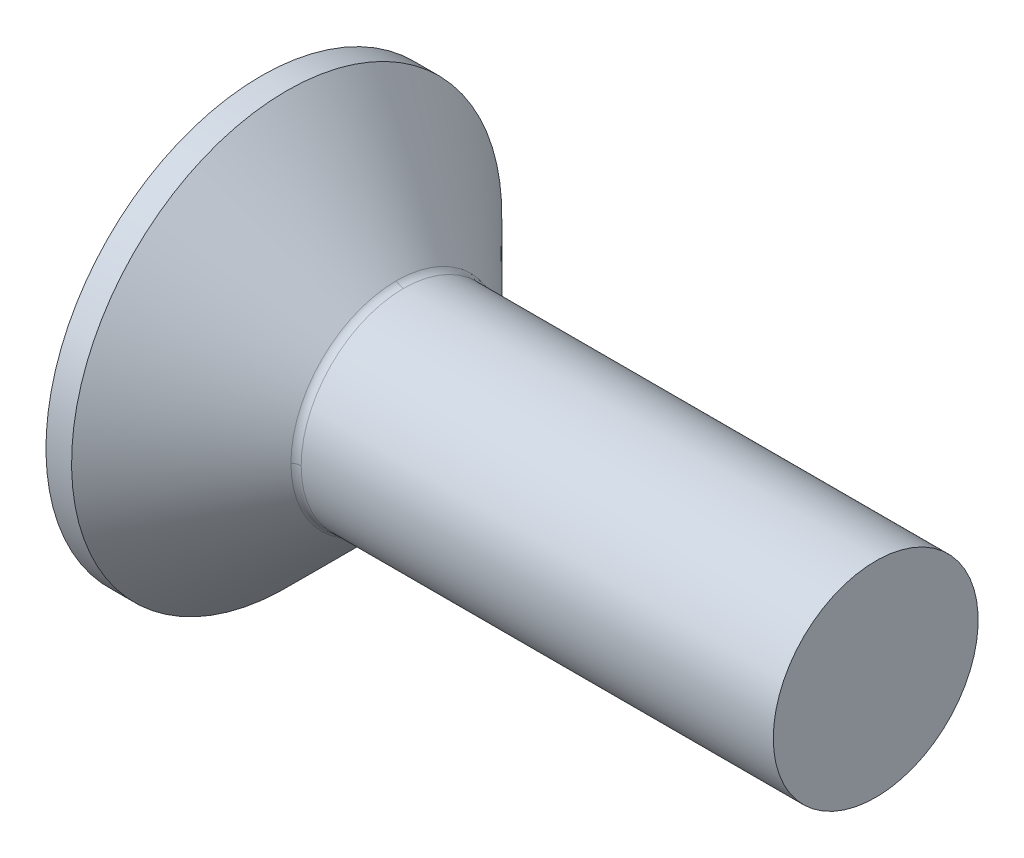
ISO-10303-21;
HEADER;
FILE_DESCRIPTION(('STEP AP214'),'2;1');
FILE_NAME('part.step','',(''),(''),'','','');
FILE_SCHEMA(('AUTOMOTIVE_DESIGN { 1 0 10303 214 1 1 1 1 }'));
ENDSEC;
DATA;
#1=APPLICATION_CONTEXT('core data for automotive mechanical design processes');
#2=APPLICATION_PROTOCOL_DEFINITION('international standard','automotive_design',2000,#1);
#3=PRODUCT_CONTEXT('',#1,'mechanical');
#4=PRODUCT('Part','Part','',(#3));
#5=PRODUCT_RELATED_PRODUCT_CATEGORY('part','',(#4));
#6=PRODUCT_DEFINITION_FORMATION('','',#4);
#7=PRODUCT_DEFINITION_CONTEXT('part definition',#1,'design');
#8=PRODUCT_DEFINITION('design','',#6,#7);
#9=PRODUCT_DEFINITION_SHAPE('','',#8);
#10=(LENGTH_UNIT() NAMED_UNIT(*) SI_UNIT(.MILLI.,.METRE.));
#11=(NAMED_UNIT(*) PLANE_ANGLE_UNIT() SI_UNIT($,.RADIAN.));
#12=(NAMED_UNIT(*) SI_UNIT($,.STERADIAN.) SOLID_ANGLE_UNIT());
#13=UNCERTAINTY_MEASURE_WITH_UNIT(LENGTH_MEASURE(1.E-05),#10,'distance_accuracy_value','');
#14=(GEOMETRIC_REPRESENTATION_CONTEXT(3) GLOBAL_UNCERTAINTY_ASSIGNED_CONTEXT((#13)) GLOBAL_UNIT_ASSIGNED_CONTEXT((#10,
#11,#12)) REPRESENTATION_CONTEXT('',''));
#15=CARTESIAN_POINT('',(0.,0.,0.));
#16=DIRECTION('',(0.,0.,1.));
#17=DIRECTION('',(1.,0.,0.));
#18=AXIS2_PLACEMENT_3D('',#15,#16,#17);
#19=CARTESIAN_POINT('',(12.,0.,0.));
#20=DIRECTION('',(1.,0.,0.));
#21=DIRECTION('',(0.,1.,0.));
#22=AXIS2_PLACEMENT_3D('',#19,#20,#21);
#23=PLANE('',#22);
#24=CARTESIAN_POINT('',(12.,0.,0.));
#25=DIRECTION('',(1.,0.,0.));
#26=DIRECTION('',(0.,0.,1.));
#27=AXIS2_PLACEMENT_3D('',#24,#25,#26);
#28=CIRCLE('',#27,2.);
#29=CARTESIAN_POINT('',(12.,0.,2.));
#30=VERTEX_POINT('',#29);
#31=EDGE_CURVE('E11',#30,#30,#28,.T.);
#32=ORIENTED_EDGE('',*,*,#31,.T.);
#33=EDGE_LOOP('',(#32));
#34=FACE_BOUND('',#33,.T.);
#35=ADVANCED_FACE('F16',(#34),#23,.T.);
#36=CARTESIAN_POINT('',(0.,0.,0.));
#37=DIRECTION('',(1.,0.,0.));
#38=DIRECTION('',(0.,0.,1.));
#39=AXIS2_PLACEMENT_3D('',#36,#37,#38);
#40=CYLINDRICAL_SURFACE('',#39,2.);
#41=CARTESIAN_POINT('',(2.78284271247462,0.,0.));
#42=DIRECTION('',(-1.,0.,0.));
#43=DIRECTION('',(0.,1.,0.));
#44=AXIS2_PLACEMENT_3D('',#41,#42,#43);
#45=CIRCLE('',#44,2.);
#46=CARTESIAN_POINT('',(2.78284271247462,0.,2.));
#47=VERTEX_POINT('',#46);
#48=CARTESIAN_POINT('',(2.78284271247462,2.,0.));
#49=VERTEX_POINT('',#48);
#50=EDGE_CURVE('E27',#47,#49,#45,.T.);
#51=ORIENTED_EDGE('',*,*,#50,.F.);
#52=CARTESIAN_POINT('',(2.78284271247462,0.,0.));
#53=DIRECTION('',(-1.,0.,0.));
#54=DIRECTION('',(0.,0.,1.));
#55=AXIS2_PLACEMENT_3D('',#52,#53,#54);
#56=CIRCLE('',#55,2.);
#57=EDGE_CURVE('E442',#49,#47,#56,.T.);
#58=ORIENTED_EDGE('',*,*,#57,.F.);
#59=EDGE_LOOP('',(#51,#58));
#60=FACE_BOUND('',#59,.T.);
#61=ORIENTED_EDGE('',*,*,#31,.F.);
#62=EDGE_LOOP('',(#61));
#63=FACE_BOUND('',#62,.T.);
#64=ADVANCED_FACE('F18',(#60,#63),#40,.T.);
#65=CARTESIAN_POINT('',(2.78284271247462,0.,0.));
#66=DIRECTION('',(1.,0.,0.));
#67=DIRECTION('',(0.,0.980066577841242,-0.198669330795061));
#68=AXIS2_PLACEMENT_3D('',#65,#66,#67);
#69=TOROIDAL_SURFACE('',#68,2.2,0.2);
#70=ORIENTED_EDGE('',*,*,#50,.T.);
#71=CARTESIAN_POINT('',(2.78284271247462,2.2,0.));
#72=DIRECTION('',(0.,0.,-1.));
#73=DIRECTION('',(0.,-1.,0.));
#74=AXIS2_PLACEMENT_3D('',#71,#72,#73);
#75=CIRCLE('',#74,0.2);
#76=CARTESIAN_POINT('',(2.64142135623731,2.05857864376269,0.));
#77=VERTEX_POINT('',#76);
#78=EDGE_CURVE('E377',#49,#77,#75,.T.);
#79=ORIENTED_EDGE('',*,*,#78,.T.);
#80=CARTESIAN_POINT('',(2.64142135623731,0.,0.));
#81=DIRECTION('',(-1.,0.,0.));
#82=DIRECTION('',(0.,1.,0.));
#83=AXIS2_PLACEMENT_3D('',#80,#81,#82);
#84=CIRCLE('',#83,2.05857864376269);
#85=CARTESIAN_POINT('',(2.64142135623731,0.,2.05857864376269));
#86=VERTEX_POINT('',#85);
#87=EDGE_CURVE('E396',#86,#77,#84,.T.);
#88=ORIENTED_EDGE('',*,*,#87,.F.);
#89=CARTESIAN_POINT('',(2.78284271247462,0.,2.2));
#90=DIRECTION('',(0.,1.,0.));
#91=DIRECTION('',(0.,0.,-1.));
#92=AXIS2_PLACEMENT_3D('',#89,#90,#91);
#93=CIRCLE('',#92,0.2);
#94=EDGE_CURVE('E380',#47,#86,#93,.T.);
#95=ORIENTED_EDGE('',*,*,#94,.F.);
#96=EDGE_LOOP('',(#70,#79,#88,#95));
#97=FACE_BOUND('',#96,.T.);
#98=ADVANCED_FACE('F743',(#97),#69,.F.);
#99=CARTESIAN_POINT('',(2.78284271247462,0.,0.));
#100=DIRECTION('',(1.,0.,0.));
#101=DIRECTION('',(0.,0.198669330795061,0.980066577841242));
#102=AXIS2_PLACEMENT_3D('',#99,#100,#101);
#103=TOROIDAL_SURFACE('',#102,2.2,0.2);
#104=ORIENTED_EDGE('',*,*,#57,.T.);
#105=ORIENTED_EDGE('',*,*,#94,.T.);
#106=CARTESIAN_POINT('',(2.64142135623731,0.,0.));
#107=DIRECTION('',(-1.,0.,0.));
#108=DIRECTION('',(0.,0.,1.));
#109=AXIS2_PLACEMENT_3D('',#106,#107,#108);
#110=CIRCLE('',#109,2.05857864376269);
#111=EDGE_CURVE('E347',#77,#86,#110,.T.);
#112=ORIENTED_EDGE('',*,*,#111,.F.);
#113=ORIENTED_EDGE('',*,*,#78,.F.);
#114=EDGE_LOOP('',(#104,#105,#112,#113));
#115=FACE_BOUND('',#114,.T.);
#116=ADVANCED_FACE('F747',(#115),#103,.F.);
#117=CARTESIAN_POINT('',(1.57071067811866,0.,0.));
#118=DIRECTION('',(-1.,0.,0.));
#119=DIRECTION('',(0.,-1.,0.));
#120=AXIS2_PLACEMENT_3D('',#117,#118,#119);
#121=CONICAL_SURFACE('',#120,3.12928932188134,0.785398163397448);
#122=ORIENTED_EDGE('',*,*,#111,.T.);
#123=ORIENTED_EDGE('',*,*,#87,.T.);
#124=EDGE_LOOP('',(#122,#123));
#125=FACE_BOUND('',#124,.T.);
#126=CARTESIAN_POINT('',(0.5,0.,0.));
#127=DIRECTION('',(1.,0.,0.));
#128=DIRECTION('',(0.,1.,0.));
#129=AXIS2_PLACEMENT_3D('',#126,#127,#128);
#130=CIRCLE('',#129,4.2);
#131=CARTESIAN_POINT('',(0.5,4.2,0.));
#132=VERTEX_POINT('',#131);
#133=EDGE_CURVE('E345',#132,#132,#130,.T.);
#134=ORIENTED_EDGE('',*,*,#133,.T.);
#135=EDGE_LOOP('',(#134));
#136=FACE_BOUND('',#135,.T.);
#137=ADVANCED_FACE('F789',(#125,#136),#121,.T.);
#138=CARTESIAN_POINT('',(2.6,0.,0.));
#139=DIRECTION('',(1.,0.,0.));
#140=DIRECTION('',(0.,1.,0.));
#141=AXIS2_PLACEMENT_3D('',#138,#139,#140);
#142=PLANE('',#141);
#143=DIRECTION('',(0.,0.,1.));
#144=VECTOR('',#143,1.);
#145=CARTESIAN_POINT('',(2.6,0.172517251725172,0.443540079669605));
#146=LINE('',#145,#144);
#147=CARTESIAN_POINT('',(2.6,0.172517251725172,0.443540079669605));
#148=VERTEX_POINT('',#147);
#149=CARTESIAN_POINT('',(2.6,0.172517251725172,0.668156442865066));
#150=VERTEX_POINT('',#149);
#151=EDGE_CURVE('E389',#148,#150,#146,.T.);
#152=ORIENTED_EDGE('',*,*,#151,.F.);
#153=DIRECTION('',(0.,-0.272628878987048,0.962119272409749));
#154=VECTOR('',#153,1.);
#155=CARTESIAN_POINT('',(2.6,0.232358321079116,0.232358321079116));
#156=LINE('',#155,#154);
#157=CARTESIAN_POINT('',(2.6,0.232358321079116,0.232358321079116));
#158=VERTEX_POINT('',#157);
#159=EDGE_CURVE('E259',#158,#148,#156,.T.);
#160=ORIENTED_EDGE('',*,*,#159,.F.);
#161=DIRECTION('',(0.,-0.96211927240975,0.272628878987045));
#162=VECTOR('',#161,1.);
#163=CARTESIAN_POINT('',(2.6,0.443540079669605,0.172517251725173));
#164=LINE('',#163,#162);
#165=CARTESIAN_POINT('',(2.6,0.443540079669605,0.172517251725173));
#166=VERTEX_POINT('',#165);
#167=EDGE_CURVE('E107',#166,#158,#164,.T.);
#168=ORIENTED_EDGE('',*,*,#167,.F.);
#169=DIRECTION('',(0.,-1.,0.));
#170=VECTOR('',#169,1.);
#171=CARTESIAN_POINT('',(2.6,0.668156442865066,0.172517251725173));
#172=LINE('',#171,#170);
#173=CARTESIAN_POINT('',(2.6,0.668156442865066,0.172517251725173));
#174=VERTEX_POINT('',#173);
#175=EDGE_CURVE('E357',#174,#166,#172,.T.);
#176=ORIENTED_EDGE('',*,*,#175,.F.);
#177=DIRECTION('',(0.,0.,1.));
#178=VECTOR('',#177,1.);
#179=CARTESIAN_POINT('',(2.6,0.668156442865066,-0.172517251725172));
#180=LINE('',#179,#178);
#181=CARTESIAN_POINT('',(2.6,0.668156442865066,-0.172517251725172));
#182=VERTEX_POINT('',#181);
#183=EDGE_CURVE('E447',#182,#174,#180,.T.);
#184=ORIENTED_EDGE('',*,*,#183,.F.);
#185=DIRECTION('',(0.,1.,0.));
#186=VECTOR('',#185,1.);
#187=CARTESIAN_POINT('',(2.6,0.443540079669605,-0.172517251725172));
#188=LINE('',#187,#186);
#189=CARTESIAN_POINT('',(2.6,0.443540079669605,-0.172517251725172));
#190=VERTEX_POINT('',#189);
#191=EDGE_CURVE('E454',#190,#182,#188,.T.);
#192=ORIENTED_EDGE('',*,*,#191,.F.);
#193=DIRECTION('',(0.,0.96211927240975,0.272628878987047));
#194=VECTOR('',#193,1.);
#195=CARTESIAN_POINT('',(2.6,0.232358321079116,-0.232358321079116));
#196=LINE('',#195,#194);
#197=CARTESIAN_POINT('',(2.6,0.232358321079116,-0.232358321079116));
#198=VERTEX_POINT('',#197);
#199=EDGE_CURVE('E437',#198,#190,#196,.T.);
#200=ORIENTED_EDGE('',*,*,#199,.F.);
#201=DIRECTION('',(0.,0.272628878987045,0.96211927240975));
#202=VECTOR('',#201,1.);
#203=CARTESIAN_POINT('',(2.6,0.172517251725173,-0.443540079669605));
#204=LINE('',#203,#202);
#205=CARTESIAN_POINT('',(2.6,0.172517251725173,-0.443540079669605));
#206=VERTEX_POINT('',#205);
#207=EDGE_CURVE('E20',#206,#198,#204,.T.);
#208=ORIENTED_EDGE('',*,*,#207,.F.);
#209=DIRECTION('',(0.,0.,1.));
#210=VECTOR('',#209,1.);
#211=CARTESIAN_POINT('',(2.6,0.172517251725173,-0.668156442865066));
#212=LINE('',#211,#210);
#213=CARTESIAN_POINT('',(2.6,0.172517251725173,-0.668156442865066));
#214=VERTEX_POINT('',#213);
#215=EDGE_CURVE('E332',#214,#206,#212,.T.);
#216=ORIENTED_EDGE('',*,*,#215,.F.);
#217=DIRECTION('',(0.,1.,0.));
#218=VECTOR('',#217,1.);
#219=CARTESIAN_POINT('',(2.6,-0.172517251725172,-0.668156442865066));
#220=LINE('',#219,#218);
#221=CARTESIAN_POINT('',(2.6,-0.172517251725172,-0.668156442865066));
#222=VERTEX_POINT('',#221);
#223=EDGE_CURVE('E302',#222,#214,#220,.T.);
#224=ORIENTED_EDGE('',*,*,#223,.F.);
#225=DIRECTION('',(0.,0.,-1.));
#226=VECTOR('',#225,1.);
#227=CARTESIAN_POINT('',(2.6,-0.172517251725172,-0.443540079669605));
#228=LINE('',#227,#226);
#229=CARTESIAN_POINT('',(2.6,-0.172517251725172,-0.443540079669605));
#230=VERTEX_POINT('',#229);
#231=EDGE_CURVE('E301',#230,#222,#228,.T.);
#232=ORIENTED_EDGE('',*,*,#231,.F.);
#233=DIRECTION('',(0.,0.272628878987046,-0.96211927240975));
#234=VECTOR('',#233,1.);
#235=CARTESIAN_POINT('',(2.6,-0.232358321079116,-0.232358321079116));
#236=LINE('',#235,#234);
#237=CARTESIAN_POINT('',(2.6,-0.232358321079116,-0.232358321079116));
#238=VERTEX_POINT('',#237);
#239=EDGE_CURVE('E356',#238,#230,#236,.T.);
#240=ORIENTED_EDGE('',*,*,#239,.F.);
#241=DIRECTION('',(0.,0.96211927240975,-0.272628878987046));
#242=VECTOR('',#241,1.);
#243=CARTESIAN_POINT('',(2.6,-0.443540079669605,-0.172517251725172));
#244=LINE('',#243,#242);
#245=CARTESIAN_POINT('',(2.6,-0.443540079669605,-0.172517251725172));
#246=VERTEX_POINT('',#245);
#247=EDGE_CURVE('E287',#246,#238,#244,.T.);
#248=ORIENTED_EDGE('',*,*,#247,.F.);
#249=DIRECTION('',(0.,1.,0.));
#250=VECTOR('',#249,1.);
#251=CARTESIAN_POINT('',(2.6,-0.668156442865066,-0.172517251725172));
#252=LINE('',#251,#250);
#253=CARTESIAN_POINT('',(2.6,-0.668156442865066,-0.172517251725172));
#254=VERTEX_POINT('',#253);
#255=EDGE_CURVE('E286',#254,#246,#252,.T.);
#256=ORIENTED_EDGE('',*,*,#255,.F.);
#257=DIRECTION('',(0.,0.,-1.));
#258=VECTOR('',#257,1.);
#259=CARTESIAN_POINT('',(2.6,-0.668156442865066,0.172517251725173));
#260=LINE('',#259,#258);
#261=CARTESIAN_POINT('',(2.6,-0.668156442865066,0.172517251725173));
#262=VERTEX_POINT('',#261);
#263=EDGE_CURVE('E267',#262,#254,#260,.T.);
#264=ORIENTED_EDGE('',*,*,#263,.F.);
#265=DIRECTION('',(0.,-1.,0.));
#266=VECTOR('',#265,1.);
#267=CARTESIAN_POINT('',(2.6,-0.443540079669605,0.172517251725173));
#268=LINE('',#267,#266);
#269=CARTESIAN_POINT('',(2.6,-0.443540079669605,0.172517251725173));
#270=VERTEX_POINT('',#269);
#271=EDGE_CURVE('E339',#270,#262,#268,.T.);
#272=ORIENTED_EDGE('',*,*,#271,.F.);
#273=DIRECTION('',(0.,-0.96211927240975,-0.272628878987045));
#274=VECTOR('',#273,1.);
#275=CARTESIAN_POINT('',(2.6,-0.232358321079116,0.232358321079116));
#276=LINE('',#275,#274);
#277=CARTESIAN_POINT('',(2.6,-0.232358321079116,0.232358321079116));
#278=VERTEX_POINT('',#277);
#279=EDGE_CURVE('E230',#278,#270,#276,.T.);
#280=ORIENTED_EDGE('',*,*,#279,.F.);
#281=DIRECTION('',(0.,-0.272628878987044,-0.962119272409751));
#282=VECTOR('',#281,1.);
#283=CARTESIAN_POINT('',(2.6,-0.172517251725173,0.443540079669605));
#284=LINE('',#283,#282);
#285=CARTESIAN_POINT('',(2.6,-0.172517251725173,0.443540079669605));
#286=VERTEX_POINT('',#285);
#287=EDGE_CURVE('E229',#286,#278,#284,.T.);
#288=ORIENTED_EDGE('',*,*,#287,.F.);
#289=DIRECTION('',(0.,0.,-1.));
#290=VECTOR('',#289,1.);
#291=CARTESIAN_POINT('',(2.6,-0.172517251725172,0.668156442865066));
#292=LINE('',#291,#290);
#293=CARTESIAN_POINT('',(2.6,-0.172517251725172,0.668156442865066));
#294=VERTEX_POINT('',#293);
#295=EDGE_CURVE('E225',#294,#286,#292,.T.);
#296=ORIENTED_EDGE('',*,*,#295,.F.);
#297=DIRECTION('',(0.,-1.,0.));
#298=VECTOR('',#297,1.);
#299=CARTESIAN_POINT('',(2.6,0.172517251725172,0.668156442865066));
#300=LINE('',#299,#298);
#301=EDGE_CURVE('E124',#150,#294,#300,.T.);
#302=ORIENTED_EDGE('',*,*,#301,.F.);
#303=EDGE_LOOP('',(#152,#160,#168,#176,#184,#192,#200,#208,#216,#224,#232,#240,#248,#256,#264,
#272,#280,#288,#296,#302));
#304=FACE_BOUND('',#303,.T.);
#305=ADVANCED_FACE('F414',(#304),#142,.F.);
#306=CARTESIAN_POINT('',(0.,0.,0.));
#307=DIRECTION('',(1.,0.,0.));
#308=DIRECTION('',(0.,1.,0.));
#309=AXIS2_PLACEMENT_3D('',#306,#307,#308);
#310=CYLINDRICAL_SURFACE('',#309,4.2);
#311=ORIENTED_EDGE('',*,*,#133,.F.);
#312=EDGE_LOOP('',(#311));
#313=FACE_BOUND('',#312,.T.);
#314=CARTESIAN_POINT('',(0.,0.,0.));
#315=DIRECTION('',(1.,0.,0.));
#316=DIRECTION('',(0.,1.,0.));
#317=AXIS2_PLACEMENT_3D('',#314,#315,#316);
#318=CIRCLE('',#317,4.2);
#319=CARTESIAN_POINT('',(0.,4.2,0.));
#320=VERTEX_POINT('',#319);
#321=EDGE_CURVE('E254',#320,#320,#318,.T.);
#322=ORIENTED_EDGE('',*,*,#321,.T.);
#323=EDGE_LOOP('',(#322));
#324=FACE_BOUND('',#323,.T.);
#325=ADVANCED_FACE('F727',(#313,#324),#310,.T.);
#326=CARTESIAN_POINT('',(0.,0.575,2.22696542406926));
#327=DIRECTION('',(0.514206841452647,0.,0.85766620791733));
#328=DIRECTION('',(0.,-1.,0.));
#329=AXIS2_PLACEMENT_3D('',#326,#327,#328);
#330=PLANE('',#329);
#331=DIRECTION('',(0.,-1.,0.));
#332=VECTOR('',#331,1.);
#333=CARTESIAN_POINT('',(0.,0.575,2.22696542406926));
#334=LINE('',#333,#332);
#335=CARTESIAN_POINT('',(0.,0.575,2.22696542406926));
#336=VERTEX_POINT('',#335);
#337=CARTESIAN_POINT('',(0.,-0.575,2.22696542406926));
#338=VERTEX_POINT('',#337);
#339=EDGE_CURVE('E247',#336,#338,#334,.T.);
#340=ORIENTED_EDGE('',*,*,#339,.F.);
#341=DIRECTION('',(0.850205551202319,-0.131612718017855,-0.509733865032247));
#342=VECTOR('',#341,1.);
#343=CARTESIAN_POINT('',(0.,0.575,2.22696542406926));
#344=LINE('',#343,#342);
#345=EDGE_CURVE('E481',#336,#150,#344,.T.);
#346=ORIENTED_EDGE('',*,*,#345,.T.);
#347=ORIENTED_EDGE('',*,*,#301,.T.);
#348=DIRECTION('',(0.850205551202319,0.131612718017856,-0.509733865032246));
#349=VECTOR('',#348,1.);
#350=CARTESIAN_POINT('',(0.,-0.575,2.22696542406926));
#351=LINE('',#350,#349);
#352=EDGE_CURVE('E294',#338,#294,#351,.T.);
#353=ORIENTED_EDGE('',*,*,#352,.F.);
#354=EDGE_LOOP('',(#340,#346,#347,#353));
#355=FACE_BOUND('',#354,.T.);
#356=ADVANCED_FACE('F759',(#355),#330,.F.);
#357=CARTESIAN_POINT('',(0.,-0.575,2.22696542406926));
#358=DIRECTION('',(0.152978962750563,-0.988229445501277,0.));
#359=DIRECTION('',(0.,0.,-1.));
#360=AXIS2_PLACEMENT_3D('',#357,#358,#359);
#361=PLANE('',#360);
#362=DIRECTION('',(0.,0.,-1.));
#363=VECTOR('',#362,1.);
#364=CARTESIAN_POINT('',(0.,-0.575,2.22696542406926));
#365=LINE('',#364,#363);
#366=CARTESIAN_POINT('',(0.,-0.575,1.47831908553879));
#367=VERTEX_POINT('',#366);
#368=EDGE_CURVE('E223',#338,#367,#365,.T.);
#369=ORIENTED_EDGE('',*,*,#368,.F.);
#370=ORIENTED_EDGE('',*,*,#352,.T.);
#371=ORIENTED_EDGE('',*,*,#295,.T.);
#372=DIRECTION('',(0.919655056316218,0.142363574819613,-0.366015286506718));
#373=VECTOR('',#372,1.);
#374=CARTESIAN_POINT('',(0.,-0.575,1.47831908553879));
#375=LINE('',#374,#373);
#376=EDGE_CURVE('E218',#367,#286,#375,.T.);
#377=ORIENTED_EDGE('',*,*,#376,.F.);
#378=EDGE_LOOP('',(#369,#370,#371,#377));
#379=FACE_BOUND('',#378,.T.);
#380=ADVANCED_FACE('F220',(#379),#361,.F.);
#381=CARTESIAN_POINT('',(0.,-0.575,1.47831908553879));
#382=DIRECTION('',(0.249312008142373,-0.931738638625509,0.264020135384217));
#383=DIRECTION('',(-0.966015607772417,-0.258483743280089,0.));
#384=AXIS2_PLACEMENT_3D('',#381,#382,#383);
#385=PLANE('',#384);
#386=DIRECTION('',(0.,-0.272628878987044,-0.962119272409751));
#387=VECTOR('',#386,1.);
#388=CARTESIAN_POINT('',(0.,-0.575,1.47831908553879));
#389=LINE('',#388,#387);
#390=CARTESIAN_POINT('',(0.,-0.774450284156694,0.774450284156694));
#391=VERTEX_POINT('',#390);
#392=EDGE_CURVE('E233',#367,#391,#389,.T.);
#393=ORIENTED_EDGE('',*,*,#392,.F.);
#394=ORIENTED_EDGE('',*,*,#376,.T.);
#395=ORIENTED_EDGE('',*,*,#287,.T.);
#396=DIRECTION('',(0.95917274636367,0.199984552694921,-0.199984552694921));
#397=VECTOR('',#396,1.);
#398=CARTESIAN_POINT('',(0.,-0.774450284156694,0.774450284156694));
#399=LINE('',#398,#397);
#400=EDGE_CURVE('E236',#391,#278,#399,.T.);
#401=ORIENTED_EDGE('',*,*,#400,.F.);
#402=EDGE_LOOP('',(#393,#394,#395,#401));
#403=FACE_BOUND('',#402,.T.);
#404=ADVANCED_FACE('F234',(#403),#385,.F.);
#405=CARTESIAN_POINT('',(0.,-0.774450284156694,0.774450284156694));
#406=DIRECTION('',(0.249312008142374,-0.264020135384219,0.931738638625508));
#407=DIRECTION('',(-0.7270686071443,-0.686564811583908,0.));
#408=AXIS2_PLACEMENT_3D('',#405,#406,#407);
#409=PLANE('',#408);
#410=DIRECTION('',(0.,-0.96211927240975,-0.272628878987046));
#411=VECTOR('',#410,1.);
#412=CARTESIAN_POINT('',(0.,-0.774450284156694,0.774450284156694));
#413=LINE('',#412,#411);
#414=CARTESIAN_POINT('',(0.,-1.47831908553879,0.575));
#415=VERTEX_POINT('',#414);
#416=EDGE_CURVE('E241',#391,#415,#413,.T.);
#417=ORIENTED_EDGE('',*,*,#416,.F.);
#418=ORIENTED_EDGE('',*,*,#400,.T.);
#419=ORIENTED_EDGE('',*,*,#279,.T.);
#420=DIRECTION('',(0.919655056316218,0.366015286506719,-0.142363574819612));
#421=VECTOR('',#420,1.);
#422=CARTESIAN_POINT('',(0.,-1.47831908553879,0.575));
#423=LINE('',#422,#421);
#424=EDGE_CURVE('E270',#415,#270,#423,.T.);
#425=ORIENTED_EDGE('',*,*,#424,.F.);
#426=EDGE_LOOP('',(#417,#418,#419,#425));
#427=FACE_BOUND('',#426,.T.);
#428=ADVANCED_FACE('F774',(#427),#409,.F.);
#429=CARTESIAN_POINT('',(0.,-1.47831908553879,0.575));
#430=DIRECTION('',(0.152978962750562,0.,0.988229445501277));
#431=DIRECTION('',(0.,-1.,0.));
#432=AXIS2_PLACEMENT_3D('',#429,#430,#431);
#433=PLANE('',#432);
#434=DIRECTION('',(0.,-1.,0.));
#435=VECTOR('',#434,1.);
#436=CARTESIAN_POINT('',(0.,-1.47831908553879,0.575));
#437=LINE('',#436,#435);
#438=CARTESIAN_POINT('',(0.,-2.22696542406926,0.575));
#439=VERTEX_POINT('',#438);
#440=EDGE_CURVE('E266',#415,#439,#437,.T.);
#441=ORIENTED_EDGE('',*,*,#440,.F.);
#442=ORIENTED_EDGE('',*,*,#424,.T.);
#443=ORIENTED_EDGE('',*,*,#271,.T.);
#444=DIRECTION('',(0.85020555120232,0.509733865032246,-0.131612718017855));
#445=VECTOR('',#444,1.);
#446=CARTESIAN_POINT('',(0.,-2.22696542406926,0.575));
#447=LINE('',#446,#445);
#448=EDGE_CURVE('E271',#439,#262,#447,.T.);
#449=ORIENTED_EDGE('',*,*,#448,.F.);
#450=EDGE_LOOP('',(#441,#442,#443,#449));
#451=FACE_BOUND('',#450,.T.);
#452=ADVANCED_FACE('F464',(#451),#433,.F.);
#453=CARTESIAN_POINT('',(0.,-2.22696542406926,0.575));
#454=DIRECTION('',(0.514206841452646,-0.85766620791733,0.));
#455=DIRECTION('',(0.,0.,-1.));
#456=AXIS2_PLACEMENT_3D('',#453,#454,#455);
#457=PLANE('',#456);
#458=DIRECTION('',(0.,0.,-1.));
#459=VECTOR('',#458,1.);
#460=CARTESIAN_POINT('',(0.,-2.22696542406926,0.575));
#461=LINE('',#460,#459);
#462=CARTESIAN_POINT('',(0.,-2.22696542406926,-0.575));
#463=VERTEX_POINT('',#462);
#464=EDGE_CURVE('E434',#439,#463,#461,.T.);
#465=ORIENTED_EDGE('',*,*,#464,.F.);
#466=ORIENTED_EDGE('',*,*,#448,.T.);
#467=ORIENTED_EDGE('',*,*,#263,.T.);
#468=DIRECTION('',(0.85020555120232,0.509733865032246,0.131612718017856));
#469=VECTOR('',#468,1.);
#470=CARTESIAN_POINT('',(0.,-2.22696542406926,-0.575));
#471=LINE('',#470,#469);
#472=EDGE_CURVE('E282',#463,#254,#471,.T.);
#473=ORIENTED_EDGE('',*,*,#472,.F.);
#474=EDGE_LOOP('',(#465,#466,#467,#473));
#475=FACE_BOUND('',#474,.T.);
#476=ADVANCED_FACE('F471',(#475),#457,.F.);
#477=CARTESIAN_POINT('',(0.,-2.22696542406926,-0.575));
#478=DIRECTION('',(0.152978962750563,0.,-0.988229445501277));
#479=DIRECTION('',(0.,-1.,0.));
#480=AXIS2_PLACEMENT_3D('',#477,#478,#479);
#481=PLANE('',#480);
#482=DIRECTION('',(0.,1.,0.));
#483=VECTOR('',#482,1.);
#484=CARTESIAN_POINT('',(0.,-2.22696542406926,-0.575));
#485=LINE('',#484,#483);
#486=CARTESIAN_POINT('',(0.,-1.47831908553879,-0.575));
#487=VERTEX_POINT('',#486);
#488=EDGE_CURVE('E293',#463,#487,#485,.T.);
#489=ORIENTED_EDGE('',*,*,#488,.F.);
#490=ORIENTED_EDGE('',*,*,#472,.T.);
#491=ORIENTED_EDGE('',*,*,#255,.T.);
#492=DIRECTION('',(0.919655056316218,0.366015286506718,0.142363574819613));
#493=VECTOR('',#492,1.);
#494=CARTESIAN_POINT('',(0.,-1.47831908553879,-0.575));
#495=LINE('',#494,#493);
#496=EDGE_CURVE('E366',#487,#246,#495,.T.);
#497=ORIENTED_EDGE('',*,*,#496,.F.);
#498=EDGE_LOOP('',(#489,#490,#491,#497));
#499=FACE_BOUND('',#498,.T.);
#500=ADVANCED_FACE('F770',(#499),#481,.F.);
#501=CARTESIAN_POINT('',(0.,-1.47831908553879,-0.575));
#502=DIRECTION('',(0.249312008142374,-0.264020135384218,-0.931738638625509));
#503=DIRECTION('',(0.,-0.96211927240975,0.272628878987045));
#504=AXIS2_PLACEMENT_3D('',#501,#502,#503);
#505=PLANE('',#504);
#506=DIRECTION('',(0.,0.96211927240975,-0.272628878987045));
#507=VECTOR('',#506,1.);
#508=CARTESIAN_POINT('',(0.,-1.47831908553879,-0.575));
#509=LINE('',#508,#507);
#510=CARTESIAN_POINT('',(0.,-0.774450284156695,-0.774450284156695));
#511=VERTEX_POINT('',#510);
#512=EDGE_CURVE('E288',#487,#511,#509,.T.);
#513=ORIENTED_EDGE('',*,*,#512,.F.);
#514=ORIENTED_EDGE('',*,*,#496,.T.);
#515=ORIENTED_EDGE('',*,*,#247,.T.);
#516=DIRECTION('',(0.95917274636367,0.199984552694921,0.199984552694921));
#517=VECTOR('',#516,1.);
#518=CARTESIAN_POINT('',(0.,-0.774450284156695,-0.774450284156695));
#519=LINE('',#518,#517);
#520=EDGE_CURVE('E352',#511,#238,#519,.T.);
#521=ORIENTED_EDGE('',*,*,#520,.F.);
#522=EDGE_LOOP('',(#513,#514,#515,#521));
#523=FACE_BOUND('',#522,.T.);
#524=ADVANCED_FACE('F764',(#523),#505,.F.);
#525=CARTESIAN_POINT('',(0.,-0.774450284156695,-0.774450284156695));
#526=DIRECTION('',(0.249312008142374,-0.931738638625509,-0.264020135384218));
#527=DIRECTION('',(0.,0.272628878987045,-0.96211927240975));
#528=AXIS2_PLACEMENT_3D('',#525,#526,#527);
#529=PLANE('',#528);
#530=DIRECTION('',(0.,0.272628878987045,-0.96211927240975));
#531=VECTOR('',#530,1.);
#532=CARTESIAN_POINT('',(0.,-0.774450284156695,-0.774450284156695));
#533=LINE('',#532,#531);
#534=CARTESIAN_POINT('',(0.,-0.575,-1.47831908553879));
#535=VERTEX_POINT('',#534);
#536=EDGE_CURVE('E292',#511,#535,#533,.T.);
#537=ORIENTED_EDGE('',*,*,#536,.F.);
#538=ORIENTED_EDGE('',*,*,#520,.T.);
#539=ORIENTED_EDGE('',*,*,#239,.T.);
#540=DIRECTION('',(0.919655056316218,0.142363574819613,0.366015286506718));
#541=VECTOR('',#540,1.);
#542=CARTESIAN_POINT('',(0.,-0.575,-1.47831908553879));
#543=LINE('',#542,#541);
#544=EDGE_CURVE('E297',#535,#230,#543,.T.);
#545=ORIENTED_EDGE('',*,*,#544,.F.);
#546=EDGE_LOOP('',(#537,#538,#539,#545));
#547=FACE_BOUND('',#546,.T.);
#548=ADVANCED_FACE('F761',(#547),#529,.F.);
#549=CARTESIAN_POINT('',(0.,-0.575,-1.47831908553879));
#550=DIRECTION('',(0.152978962750563,-0.988229445501277,0.));
#551=DIRECTION('',(0.,0.,-1.));
#552=AXIS2_PLACEMENT_3D('',#549,#550,#551);
#553=PLANE('',#552);
#554=DIRECTION('',(0.,0.,-1.));
#555=VECTOR('',#554,1.);
#556=CARTESIAN_POINT('',(0.,-0.575,-1.47831908553879));
#557=LINE('',#556,#555);
#558=CARTESIAN_POINT('',(0.,-0.575,-2.22696542406926));
#559=VERTEX_POINT('',#558);
#560=EDGE_CURVE('E308',#535,#559,#557,.T.);
#561=ORIENTED_EDGE('',*,*,#560,.F.);
#562=ORIENTED_EDGE('',*,*,#544,.T.);
#563=ORIENTED_EDGE('',*,*,#231,.T.);
#564=DIRECTION('',(0.850205551202319,0.131612718017856,0.509733865032247));
#565=VECTOR('',#564,1.);
#566=CARTESIAN_POINT('',(0.,-0.575,-2.22696542406926));
#567=LINE('',#566,#565);
#568=EDGE_CURVE('E328',#559,#222,#567,.T.);
#569=ORIENTED_EDGE('',*,*,#568,.F.);
#570=EDGE_LOOP('',(#561,#562,#563,#569));
#571=FACE_BOUND('',#570,.T.);
#572=ADVANCED_FACE('F753',(#571),#553,.F.);
#573=CARTESIAN_POINT('',(0.,-0.575,-2.22696542406926));
#574=DIRECTION('',(0.514206841452647,0.,-0.85766620791733));
#575=DIRECTION('',(0.,-1.,0.));
#576=AXIS2_PLACEMENT_3D('',#573,#574,#575);
#577=PLANE('',#576);
#578=DIRECTION('',(0.,1.,0.));
#579=VECTOR('',#578,1.);
#580=CARTESIAN_POINT('',(0.,-0.575,-2.22696542406926));
#581=LINE('',#580,#579);
#582=CARTESIAN_POINT('',(0.,0.575,-2.22696542406926));
#583=VERTEX_POINT('',#582);
#584=EDGE_CURVE('E311',#559,#583,#581,.T.);
#585=ORIENTED_EDGE('',*,*,#584,.F.);
#586=ORIENTED_EDGE('',*,*,#568,.T.);
#587=ORIENTED_EDGE('',*,*,#223,.T.);
#588=DIRECTION('',(0.850205551202319,-0.131612718017855,0.509733865032247));
#589=VECTOR('',#588,1.);
#590=CARTESIAN_POINT('',(0.,0.575,-2.22696542406926));
#591=LINE('',#590,#589);
#592=EDGE_CURVE('E410',#583,#214,#591,.T.);
#593=ORIENTED_EDGE('',*,*,#592,.F.);
#594=EDGE_LOOP('',(#585,#586,#587,#593));
#595=FACE_BOUND('',#594,.T.);
#596=ADVANCED_FACE('F408',(#595),#577,.F.);
#597=CARTESIAN_POINT('',(0.,0.575,-2.22696542406926));
#598=DIRECTION('',(0.152978962750562,0.988229445501277,0.));
#599=DIRECTION('',(0.,0.,-1.));
#600=AXIS2_PLACEMENT_3D('',#597,#598,#599);
#601=PLANE('',#600);
#602=DIRECTION('',(0.,0.,1.));
#603=VECTOR('',#602,1.);
#604=CARTESIAN_POINT('',(0.,0.575,-2.22696542406926));
#605=LINE('',#604,#603);
#606=CARTESIAN_POINT('',(0.,0.575,-1.47831908553879));
#607=VERTEX_POINT('',#606);
#608=EDGE_CURVE('E319',#583,#607,#605,.T.);
#609=ORIENTED_EDGE('',*,*,#608,.F.);
#610=ORIENTED_EDGE('',*,*,#592,.T.);
#611=ORIENTED_EDGE('',*,*,#215,.T.);
#612=DIRECTION('',(0.919655056316218,-0.142363574819612,0.366015286506718));
#613=VECTOR('',#612,1.);
#614=CARTESIAN_POINT('',(0.,0.575,-1.47831908553879));
#615=LINE('',#614,#613);
#616=EDGE_CURVE('E427',#607,#206,#615,.T.);
#617=ORIENTED_EDGE('',*,*,#616,.F.);
#618=EDGE_LOOP('',(#609,#610,#611,#617));
#619=FACE_BOUND('',#618,.T.);
#620=ADVANCED_FACE('F421',(#619),#601,.F.);
#621=CARTESIAN_POINT('',(0.,0.575,-1.47831908553879));
#622=DIRECTION('',(0.249312008142374,0.931738638625508,-0.264020135384221));
#623=DIRECTION('',(-0.727068607144303,0.,-0.686564811583906));
#624=AXIS2_PLACEMENT_3D('',#621,#622,#623);
#625=PLANE('',#624);
#626=DIRECTION('',(0.,0.272628878987048,0.962119272409749));
#627=VECTOR('',#626,1.);
#628=CARTESIAN_POINT('',(0.,0.575,-1.47831908553879));
#629=LINE('',#628,#627);
#630=CARTESIAN_POINT('',(0.,0.774450284156695,-0.774450284156695));
#631=VERTEX_POINT('',#630);
#632=EDGE_CURVE('E307',#607,#631,#629,.T.);
#633=ORIENTED_EDGE('',*,*,#632,.F.);
#634=ORIENTED_EDGE('',*,*,#616,.T.);
#635=ORIENTED_EDGE('',*,*,#207,.T.);
#636=DIRECTION('',(0.95917274636367,-0.199984552694921,0.199984552694921));
#637=VECTOR('',#636,1.);
#638=CARTESIAN_POINT('',(0.,0.774450284156695,-0.774450284156695));
#639=LINE('',#638,#637);
#640=EDGE_CURVE('E487',#631,#198,#639,.T.);
#641=ORIENTED_EDGE('',*,*,#640,.F.);
#642=EDGE_LOOP('',(#633,#634,#635,#641));
#643=FACE_BOUND('',#642,.T.);
#644=ADVANCED_FACE('F766',(#643),#625,.F.);
#645=CARTESIAN_POINT('',(0.,0.774450284156695,-0.774450284156695));
#646=DIRECTION('',(0.249312008142374,0.26402013538422,-0.931738638625508));
#647=DIRECTION('',(-0.966015607772417,0.,-0.258483743280091));
#648=AXIS2_PLACEMENT_3D('',#645,#646,#647);
#649=PLANE('',#648);
#650=DIRECTION('',(0.,0.96211927240975,0.272628878987047));
#651=VECTOR('',#650,1.);
#652=CARTESIAN_POINT('',(0.,0.774450284156695,-0.774450284156695));
#653=LINE('',#652,#651);
#654=CARTESIAN_POINT('',(0.,1.47831908553879,-0.575));
#655=VERTEX_POINT('',#654);
#656=EDGE_CURVE('E303',#631,#655,#653,.T.);
#657=ORIENTED_EDGE('',*,*,#656,.F.);
#658=ORIENTED_EDGE('',*,*,#640,.T.);
#659=ORIENTED_EDGE('',*,*,#199,.T.);
#660=DIRECTION('',(0.919655056316218,-0.366015286506718,0.142363574819613));
#661=VECTOR('',#660,1.);
#662=CARTESIAN_POINT('',(0.,1.47831908553879,-0.575));
#663=LINE('',#662,#661);
#664=EDGE_CURVE('E450',#655,#190,#663,.T.);
#665=ORIENTED_EDGE('',*,*,#664,.F.);
#666=EDGE_LOOP('',(#657,#658,#659,#665));
#667=FACE_BOUND('',#666,.T.);
#668=ADVANCED_FACE('F543',(#667),#649,.F.);
#669=CARTESIAN_POINT('',(0.,1.47831908553879,-0.575));
#670=DIRECTION('',(0.152978962750563,0.,-0.988229445501277));
#671=DIRECTION('',(0.,-1.,0.));
#672=AXIS2_PLACEMENT_3D('',#669,#670,#671);
#673=PLANE('',#672);
#674=DIRECTION('',(0.,1.,0.));
#675=VECTOR('',#674,1.);
#676=CARTESIAN_POINT('',(0.,1.47831908553879,-0.575));
#677=LINE('',#676,#675);
#678=CARTESIAN_POINT('',(0.,2.22696542406926,-0.575));
#679=VERTEX_POINT('',#678);
#680=EDGE_CURVE('E306',#655,#679,#677,.T.);
#681=ORIENTED_EDGE('',*,*,#680,.F.);
#682=ORIENTED_EDGE('',*,*,#664,.T.);
#683=ORIENTED_EDGE('',*,*,#191,.T.);
#684=DIRECTION('',(0.850205551202319,-0.509733865032247,0.131612718017856));
#685=VECTOR('',#684,1.);
#686=CARTESIAN_POINT('',(0.,2.22696542406926,-0.575));
#687=LINE('',#686,#685);
#688=EDGE_CURVE('E360',#679,#182,#687,.T.);
#689=ORIENTED_EDGE('',*,*,#688,.F.);
#690=EDGE_LOOP('',(#681,#682,#683,#689));
#691=FACE_BOUND('',#690,.T.);
#692=ADVANCED_FACE('F524',(#691),#673,.F.);
#693=CARTESIAN_POINT('',(0.,2.22696542406926,-0.575));
#694=DIRECTION('',(0.514206841452647,0.85766620791733,0.));
#695=DIRECTION('',(0.,0.,-1.));
#696=AXIS2_PLACEMENT_3D('',#693,#694,#695);
#697=PLANE('',#696);
#698=DIRECTION('',(0.,0.,1.));
#699=VECTOR('',#698,1.);
#700=CARTESIAN_POINT('',(0.,2.22696542406926,-0.575));
#701=LINE('',#700,#699);
#702=CARTESIAN_POINT('',(0.,2.22696542406926,0.575));
#703=VERTEX_POINT('',#702);
#704=EDGE_CURVE('E277',#679,#703,#701,.T.);
#705=ORIENTED_EDGE('',*,*,#704,.F.);
#706=ORIENTED_EDGE('',*,*,#688,.T.);
#707=ORIENTED_EDGE('',*,*,#183,.T.);
#708=DIRECTION('',(0.850205551202319,-0.509733865032247,-0.131612718017855));
#709=VECTOR('',#708,1.);
#710=CARTESIAN_POINT('',(0.,2.22696542406926,0.575));
#711=LINE('',#710,#709);
#712=EDGE_CURVE('E361',#703,#174,#711,.T.);
#713=ORIENTED_EDGE('',*,*,#712,.F.);
#714=EDGE_LOOP('',(#705,#706,#707,#713));
#715=FACE_BOUND('',#714,.T.);
#716=ADVANCED_FACE('F519',(#715),#697,.F.);
#717=CARTESIAN_POINT('',(0.,2.22696542406926,0.575));
#718=DIRECTION('',(0.152978962750563,0.,0.988229445501277));
#719=DIRECTION('',(0.,-1.,0.));
#720=AXIS2_PLACEMENT_3D('',#717,#718,#719);
#721=PLANE('',#720);
#722=DIRECTION('',(0.,-1.,0.));
#723=VECTOR('',#722,1.);
#724=CARTESIAN_POINT('',(0.,2.22696542406926,0.575));
#725=LINE('',#724,#723);
#726=CARTESIAN_POINT('',(0.,1.47831908553879,0.575));
#727=VERTEX_POINT('',#726);
#728=EDGE_CURVE('E272',#703,#727,#725,.T.);
#729=ORIENTED_EDGE('',*,*,#728,.F.);
#730=ORIENTED_EDGE('',*,*,#712,.T.);
#731=ORIENTED_EDGE('',*,*,#175,.T.);
#732=DIRECTION('',(0.919655056316218,-0.366015286506718,-0.142363574819612));
#733=VECTOR('',#732,1.);
#734=CARTESIAN_POINT('',(0.,1.47831908553879,0.575));
#735=LINE('',#734,#733);
#736=EDGE_CURVE('E262',#727,#166,#735,.T.);
#737=ORIENTED_EDGE('',*,*,#736,.F.);
#738=EDGE_LOOP('',(#729,#730,#731,#737));
#739=FACE_BOUND('',#738,.T.);
#740=ADVANCED_FACE('F536',(#739),#721,.F.);
#741=CARTESIAN_POINT('',(0.,1.47831908553879,0.575));
#742=DIRECTION('',(0.249312008142374,0.264020135384219,0.931738638625508));
#743=DIRECTION('',(0.7270686071443,-0.686564811583908,0.));
#744=AXIS2_PLACEMENT_3D('',#741,#742,#743);
#745=PLANE('',#744);
#746=DIRECTION('',(0.,-0.96211927240975,0.272628878987046));
#747=VECTOR('',#746,1.);
#748=CARTESIAN_POINT('',(0.,1.47831908553879,0.575));
#749=LINE('',#748,#747);
#750=CARTESIAN_POINT('',(0.,0.774450284156695,0.774450284156694));
#751=VERTEX_POINT('',#750);
#752=EDGE_CURVE('E276',#727,#751,#749,.T.);
#753=ORIENTED_EDGE('',*,*,#752,.F.);
#754=ORIENTED_EDGE('',*,*,#736,.T.);
#755=ORIENTED_EDGE('',*,*,#167,.T.);
#756=DIRECTION('',(0.95917274636367,-0.199984552694921,-0.199984552694921));
#757=VECTOR('',#756,1.);
#758=CARTESIAN_POINT('',(0.,0.774450284156695,0.774450284156694));
#759=LINE('',#758,#757);
#760=EDGE_CURVE('E263',#751,#158,#759,.T.);
#761=ORIENTED_EDGE('',*,*,#760,.F.);
#762=EDGE_LOOP('',(#753,#754,#755,#761));
#763=FACE_BOUND('',#762,.T.);
#764=ADVANCED_FACE('F537',(#763),#745,.F.);
#765=CARTESIAN_POINT('',(0.,0.774450284156695,0.774450284156694));
#766=DIRECTION('',(0.249312008142374,0.931738638625508,0.264020135384221));
#767=DIRECTION('',(0.727068607144303,0.,-0.686564811583906));
#768=AXIS2_PLACEMENT_3D('',#765,#766,#767);
#769=PLANE('',#768);
#770=DIRECTION('',(0.,-0.272628878987048,0.962119272409749));
#771=VECTOR('',#770,1.);
#772=CARTESIAN_POINT('',(0.,0.774450284156695,0.774450284156694));
#773=LINE('',#772,#771);
#774=CARTESIAN_POINT('',(0.,0.575,1.47831908553879));
#775=VERTEX_POINT('',#774);
#776=EDGE_CURVE('E281',#751,#775,#773,.T.);
#777=ORIENTED_EDGE('',*,*,#776,.F.);
#778=ORIENTED_EDGE('',*,*,#760,.T.);
#779=ORIENTED_EDGE('',*,*,#159,.T.);
#780=DIRECTION('',(0.919655056316218,-0.142363574819612,-0.366015286506718));
#781=VECTOR('',#780,1.);
#782=CARTESIAN_POINT('',(0.,0.575,1.47831908553879));
#783=LINE('',#782,#781);
#784=EDGE_CURVE('E365',#775,#148,#783,.T.);
#785=ORIENTED_EDGE('',*,*,#784,.F.);
#786=EDGE_LOOP('',(#777,#778,#779,#785));
#787=FACE_BOUND('',#786,.T.);
#788=ADVANCED_FACE('F545',(#787),#769,.F.);
#789=CARTESIAN_POINT('',(0.,0.575,1.47831908553879));
#790=DIRECTION('',(0.152978962750562,0.988229445501277,0.));
#791=DIRECTION('',(0.,0.,-1.));
#792=AXIS2_PLACEMENT_3D('',#789,#790,#791);
#793=PLANE('',#792);
#794=DIRECTION('',(0.,0.,1.));
#795=VECTOR('',#794,1.);
#796=CARTESIAN_POINT('',(0.,0.575,1.47831908553879));
#797=LINE('',#796,#795);
#798=EDGE_CURVE('E362',#775,#336,#797,.T.);
#799=ORIENTED_EDGE('',*,*,#798,.F.);
#800=ORIENTED_EDGE('',*,*,#784,.T.);
#801=ORIENTED_EDGE('',*,*,#151,.T.);
#802=ORIENTED_EDGE('',*,*,#345,.F.);
#803=EDGE_LOOP('',(#799,#800,#801,#802));
#804=FACE_BOUND('',#803,.T.);
#805=ADVANCED_FACE('F729',(#804),#793,.F.);
#806=CARTESIAN_POINT('',(0.,0.,0.));
#807=DIRECTION('',(1.,0.,0.));
#808=DIRECTION('',(0.,1.,0.));
#809=AXIS2_PLACEMENT_3D('',#806,#807,#808);
#810=PLANE('',#809);
#811=ORIENTED_EDGE('',*,*,#339,.T.);
#812=ORIENTED_EDGE('',*,*,#368,.T.);
#813=ORIENTED_EDGE('',*,*,#392,.T.);
#814=ORIENTED_EDGE('',*,*,#416,.T.);
#815=ORIENTED_EDGE('',*,*,#440,.T.);
#816=ORIENTED_EDGE('',*,*,#464,.T.);
#817=ORIENTED_EDGE('',*,*,#488,.T.);
#818=ORIENTED_EDGE('',*,*,#512,.T.);
#819=ORIENTED_EDGE('',*,*,#536,.T.);
#820=ORIENTED_EDGE('',*,*,#560,.T.);
#821=ORIENTED_EDGE('',*,*,#584,.T.);
#822=ORIENTED_EDGE('',*,*,#608,.T.);
#823=ORIENTED_EDGE('',*,*,#632,.T.);
#824=ORIENTED_EDGE('',*,*,#656,.T.);
#825=ORIENTED_EDGE('',*,*,#680,.T.);
#826=ORIENTED_EDGE('',*,*,#704,.T.);
#827=ORIENTED_EDGE('',*,*,#728,.T.);
#828=ORIENTED_EDGE('',*,*,#752,.T.);
#829=ORIENTED_EDGE('',*,*,#776,.T.);
#830=ORIENTED_EDGE('',*,*,#798,.T.);
#831=EDGE_LOOP('',(#811,#812,#813,#814,#815,#816,#817,#818,#819,#820,#821,#822,#823,#824,#825,
#826,#827,#828,#829,#830));
#832=FACE_BOUND('',#831,.T.);
#833=ORIENTED_EDGE('',*,*,#321,.F.);
#834=EDGE_LOOP('',(#833));
#835=FACE_BOUND('',#834,.T.);
#836=ADVANCED_FACE('F243',(#832,#835),#810,.F.);
#837=CLOSED_SHELL('',(#35,#64,#98,#116,#137,#305,#325,#356,#380,#404,#428,#452,#476,#500,#524,
#548,#572,#596,#620,#644,#668,#692,#716,#740,#764,#788,#805,#836));
#838=MANIFOLD_SOLID_BREP('B1',#837);
#839=ADVANCED_BREP_SHAPE_REPRESENTATION('',(#18,#838),#14);
#840=SHAPE_DEFINITION_REPRESENTATION(#9,#839);
ENDSEC;
END-ISO-10303-21;
